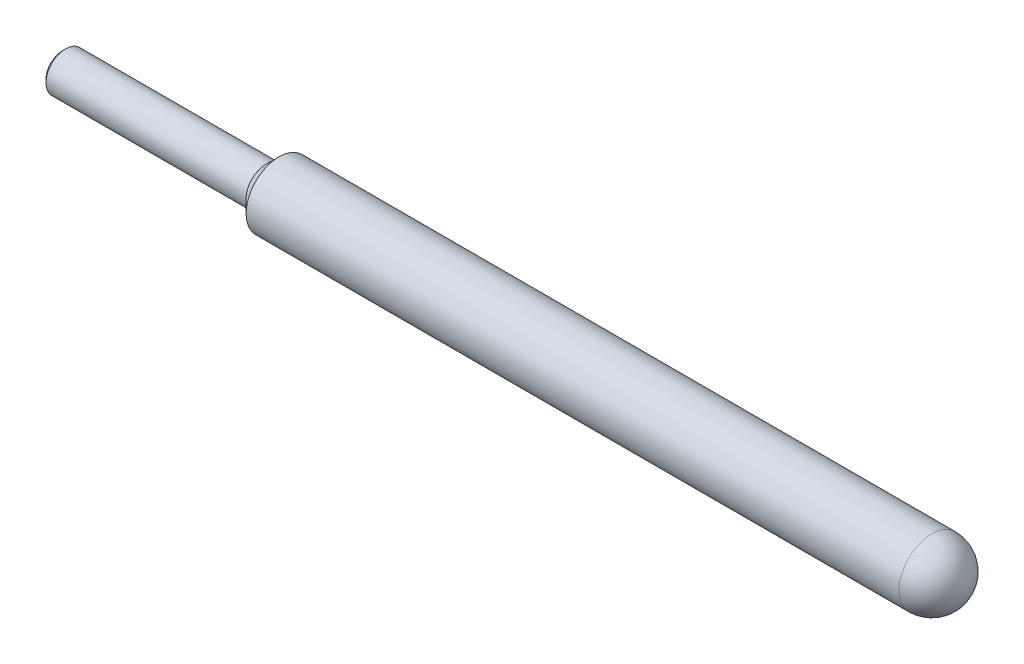
ISO-10303-21;
HEADER;
FILE_DESCRIPTION(('STEP AP214'),'2;1');
FILE_NAME('part.step','',(''),(''),'','','');
FILE_SCHEMA(('AUTOMOTIVE_DESIGN { 1 0 10303 214 1 1 1 1 }'));
ENDSEC;
DATA;
#1=APPLICATION_CONTEXT('core data for automotive mechanical design processes');
#2=APPLICATION_PROTOCOL_DEFINITION('international standard','automotive_design',2000,#1);
#3=PRODUCT_CONTEXT('',#1,'mechanical');
#4=PRODUCT('Part','Part','',(#3));
#5=PRODUCT_RELATED_PRODUCT_CATEGORY('part','',(#4));
#6=PRODUCT_DEFINITION_FORMATION('','',#4);
#7=PRODUCT_DEFINITION_CONTEXT('part definition',#1,'design');
#8=PRODUCT_DEFINITION('design','',#6,#7);
#9=PRODUCT_DEFINITION_SHAPE('','',#8);
#10=(LENGTH_UNIT() NAMED_UNIT(*) SI_UNIT(.MILLI.,.METRE.));
#11=(NAMED_UNIT(*) PLANE_ANGLE_UNIT() SI_UNIT($,.RADIAN.));
#12=(NAMED_UNIT(*) SI_UNIT($,.STERADIAN.) SOLID_ANGLE_UNIT());
#13=UNCERTAINTY_MEASURE_WITH_UNIT(LENGTH_MEASURE(1.E-05),#10,'distance_accuracy_value','');
#14=(GEOMETRIC_REPRESENTATION_CONTEXT(3) GLOBAL_UNCERTAINTY_ASSIGNED_CONTEXT((#13)) GLOBAL_UNIT_ASSIGNED_CONTEXT((#10,
#11,#12)) REPRESENTATION_CONTEXT('',''));
#15=CARTESIAN_POINT('',(0.,0.,0.));
#16=DIRECTION('',(0.,0.,1.));
#17=DIRECTION('',(1.,0.,0.));
#18=AXIS2_PLACEMENT_3D('',#15,#16,#17);
#19=CARTESIAN_POINT('',(-137.5,0.,0.));
#20=DIRECTION('',(1.,0.,0.));
#21=DIRECTION('',(0.,0.,-1.));
#22=AXIS2_PLACEMENT_3D('',#19,#20,#21);
#23=PLANE('',#22);
#24=CARTESIAN_POINT('',(-137.5,0.,0.));
#25=DIRECTION('',(1.,0.,0.));
#26=DIRECTION('',(0.,0.,-1.));
#27=AXIS2_PLACEMENT_3D('',#24,#25,#26);
#28=CIRCLE('',#27,5.00000000000006);
#29=CARTESIAN_POINT('',(-137.5,0.,-5.00000000000006));
#30=VERTEX_POINT('',#29);
#31=EDGE_CURVE('E51',#30,#30,#28,.F.);
#32=ORIENTED_EDGE('',*,*,#31,.T.);
#33=EDGE_LOOP('',(#32));
#34=FACE_BOUND('',#33,.T.);
#35=ADVANCED_FACE('F43',(#34),#23,.F.);
#36=CARTESIAN_POINT('',(-137.5,0.,0.));
#37=DIRECTION('',(-1.,0.,0.));
#38=DIRECTION('',(0.,0.,1.));
#39=AXIS2_PLACEMENT_3D('',#36,#37,#38);
#40=CYLINDRICAL_SURFACE('',#39,6.);
#41=CARTESIAN_POINT('',(-136.5,0.,0.));
#42=DIRECTION('',(1.,0.,0.));
#43=DIRECTION('',(0.,0.,-1.));
#44=AXIS2_PLACEMENT_3D('',#41,#42,#43);
#45=CIRCLE('',#44,6.);
#46=CARTESIAN_POINT('',(-136.5,0.,-6.));
#47=VERTEX_POINT('',#46);
#48=EDGE_CURVE('E10',#47,#47,#45,.T.);
#49=ORIENTED_EDGE('',*,*,#48,.T.);
#50=EDGE_LOOP('',(#49));
#51=FACE_BOUND('',#50,.T.);
#52=CARTESIAN_POINT('',(-75.5,0.,0.));
#53=DIRECTION('',(-1.,0.,0.));
#54=DIRECTION('',(0.,0.,1.));
#55=AXIS2_PLACEMENT_3D('',#52,#53,#54);
#56=CIRCLE('',#55,6.);
#57=CARTESIAN_POINT('',(-75.5,0.,6.));
#58=VERTEX_POINT('',#57);
#59=EDGE_CURVE('E56',#58,#58,#56,.T.);
#60=ORIENTED_EDGE('',*,*,#59,.T.);
#61=EDGE_LOOP('',(#60));
#62=FACE_BOUND('',#61,.T.);
#63=ADVANCED_FACE('F78',(#51,#62),#40,.T.);
#64=CARTESIAN_POINT('',(-71.5,0.,0.));
#65=DIRECTION('',(1.,0.,0.));
#66=DIRECTION('',(0.,0.,-1.));
#67=AXIS2_PLACEMENT_3D('',#64,#65,#66);
#68=CONICAL_SURFACE('',#67,10.,0.78539816339745);
#69=ORIENTED_EDGE('',*,*,#59,.F.);
#70=EDGE_LOOP('',(#69));
#71=FACE_BOUND('',#70,.T.);
#72=CARTESIAN_POINT('',(-71.5,0.,0.));
#73=DIRECTION('',(-1.,0.,0.));
#74=DIRECTION('',(0.,0.,1.));
#75=AXIS2_PLACEMENT_3D('',#72,#73,#74);
#76=CIRCLE('',#75,10.);
#77=CARTESIAN_POINT('',(-71.5,0.,10.));
#78=VERTEX_POINT('',#77);
#79=EDGE_CURVE('E61',#78,#78,#76,.T.);
#80=ORIENTED_EDGE('',*,*,#79,.T.);
#81=EDGE_LOOP('',(#80));
#82=FACE_BOUND('',#81,.T.);
#83=ADVANCED_FACE('F69',(#71,#82),#68,.T.);
#84=CARTESIAN_POINT('',(-137.5,0.,0.));
#85=DIRECTION('',(-1.,0.,0.));
#86=DIRECTION('',(0.,0.,1.));
#87=AXIS2_PLACEMENT_3D('',#84,#85,#86);
#88=CYLINDRICAL_SURFACE('',#87,10.);
#89=CARTESIAN_POINT('',(127.5,0.,0.));
#90=DIRECTION('',(-1.,0.,0.));
#91=DIRECTION('',(0.,0.,1.));
#92=AXIS2_PLACEMENT_3D('',#89,#90,#91);
#93=CIRCLE('',#92,10.);
#94=CARTESIAN_POINT('',(127.5,0.,10.));
#95=VERTEX_POINT('',#94);
#96=EDGE_CURVE('E54',#95,#95,#93,.T.);
#97=ORIENTED_EDGE('',*,*,#96,.T.);
#98=EDGE_LOOP('',(#97));
#99=FACE_BOUND('',#98,.T.);
#100=ORIENTED_EDGE('',*,*,#79,.F.);
#101=EDGE_LOOP('',(#100));
#102=FACE_BOUND('',#101,.T.);
#103=ADVANCED_FACE('F68',(#99,#102),#88,.T.);
#104=CARTESIAN_POINT('',(127.5,0.,0.));
#105=DIRECTION('',(-1.,0.,0.));
#106=DIRECTION('',(0.,0.,1.));
#107=AXIS2_PLACEMENT_3D('',#104,#105,#106);
#108=SPHERICAL_SURFACE('',#107,10.);
#109=ORIENTED_EDGE('',*,*,#96,.F.);
#110=EDGE_LOOP('',(#109));
#111=FACE_BOUND('',#110,.T.);
#112=ADVANCED_FACE('F75',(#111),#108,.T.);
#113=CARTESIAN_POINT('',(-137.5,0.,0.));
#114=DIRECTION('',(1.,0.,0.));
#115=DIRECTION('',(0.,0.,-1.));
#116=AXIS2_PLACEMENT_3D('',#113,#114,#115);
#117=CONICAL_SURFACE('',#116,5.00000000000006,0.785398163397446);
#118=ORIENTED_EDGE('',*,*,#48,.F.);
#119=EDGE_LOOP('',(#118));
#120=FACE_BOUND('',#119,.T.);
#121=ORIENTED_EDGE('',*,*,#31,.F.);
#122=EDGE_LOOP('',(#121));
#123=FACE_BOUND('',#122,.T.);
#124=ADVANCED_FACE('F46',(#120,#123),#117,.T.);
#125=CLOSED_SHELL('',(#35,#63,#83,#103,#112,#124));
#126=MANIFOLD_SOLID_BREP('B2',#125);
#127=ADVANCED_BREP_SHAPE_REPRESENTATION('',(#18,#126),#14);
#128=SHAPE_DEFINITION_REPRESENTATION(#9,#127);
ENDSEC;
END-ISO-10303-21;
